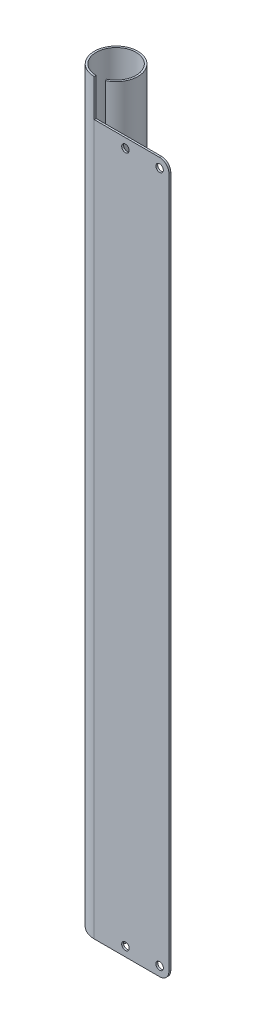
ISO-10303-21;
HEADER;
FILE_DESCRIPTION(('STEP AP214'),'2;1');
FILE_NAME('part.step','',(''),(''),'','','');
FILE_SCHEMA(('AUTOMOTIVE_DESIGN { 1 0 10303 214 1 1 1 1 }'));
ENDSEC;
DATA;
#1=APPLICATION_CONTEXT('core data for automotive mechanical design processes');
#2=APPLICATION_PROTOCOL_DEFINITION('international standard','automotive_design',2000,#1);
#3=PRODUCT_CONTEXT('',#1,'mechanical');
#4=PRODUCT('Part','Part','',(#3));
#5=PRODUCT_RELATED_PRODUCT_CATEGORY('part','',(#4));
#6=PRODUCT_DEFINITION_FORMATION('','',#4);
#7=PRODUCT_DEFINITION_CONTEXT('part definition',#1,'design');
#8=PRODUCT_DEFINITION('design','',#6,#7);
#9=PRODUCT_DEFINITION_SHAPE('','',#8);
#10=(LENGTH_UNIT() NAMED_UNIT(*) SI_UNIT(.MILLI.,.METRE.));
#11=(NAMED_UNIT(*) PLANE_ANGLE_UNIT() SI_UNIT($,.RADIAN.));
#12=(NAMED_UNIT(*) SI_UNIT($,.STERADIAN.) SOLID_ANGLE_UNIT());
#13=UNCERTAINTY_MEASURE_WITH_UNIT(LENGTH_MEASURE(1.E-05),#10,'distance_accuracy_value','');
#14=(GEOMETRIC_REPRESENTATION_CONTEXT(3) GLOBAL_UNCERTAINTY_ASSIGNED_CONTEXT((#13)) GLOBAL_UNIT_ASSIGNED_CONTEXT((#10,
#11,#12)) REPRESENTATION_CONTEXT('',''));
#15=CARTESIAN_POINT('',(0.,0.,0.));
#16=DIRECTION('',(0.,0.,1.));
#17=DIRECTION('',(1.,0.,0.));
#18=AXIS2_PLACEMENT_3D('',#15,#16,#17);
#19=CARTESIAN_POINT('',(40.,-400.,-1.));
#20=DIRECTION('',(-1.,0.,0.));
#21=DIRECTION('',(0.,0.,1.));
#22=AXIS2_PLACEMENT_3D('',#19,#20,#21);
#23=PLANE('',#22);
#24=DIRECTION('',(0.,0.,-1.));
#25=VECTOR('',#24,1.);
#26=CARTESIAN_POINT('',(40.,-395.,0.));
#27=LINE('',#26,#25);
#28=CARTESIAN_POINT('',(40.,-395.,0.));
#29=VERTEX_POINT('',#28);
#30=CARTESIAN_POINT('',(40.,-395.,-1.));
#31=VERTEX_POINT('',#30);
#32=EDGE_CURVE('E116',#29,#31,#27,.T.);
#33=ORIENTED_EDGE('',*,*,#32,.T.);
#34=DIRECTION('',(0.,1.,0.));
#35=VECTOR('',#34,1.);
#36=CARTESIAN_POINT('',(40.,-400.,-1.));
#37=LINE('',#36,#35);
#38=CARTESIAN_POINT('',(40.,-25.,-1.));
#39=VERTEX_POINT('',#38);
#40=EDGE_CURVE('E136',#31,#39,#37,.T.);
#41=ORIENTED_EDGE('',*,*,#40,.T.);
#42=DIRECTION('',(0.,0.,1.));
#43=VECTOR('',#42,1.);
#44=CARTESIAN_POINT('',(40.,-25.,-23.401));
#45=LINE('',#44,#43);
#46=CARTESIAN_POINT('',(40.,-25.,0.));
#47=VERTEX_POINT('',#46);
#48=EDGE_CURVE('E135',#39,#47,#45,.T.);
#49=ORIENTED_EDGE('',*,*,#48,.T.);
#50=DIRECTION('',(0.,1.,0.));
#51=VECTOR('',#50,1.);
#52=CARTESIAN_POINT('',(40.,-400.,0.));
#53=LINE('',#52,#51);
#54=EDGE_CURVE('E128',#29,#47,#53,.T.);
#55=ORIENTED_EDGE('',*,*,#54,.F.);
#56=EDGE_LOOP('',(#33,#41,#49,#55));
#57=FACE_BOUND('',#56,.T.);
#58=ADVANCED_FACE('F36',(#57),#23,.F.);
#59=CARTESIAN_POINT('',(0.,-400.,-1.));
#60=DIRECTION('',(0.,0.,-1.));
#61=DIRECTION('',(-1.,0.,0.));
#62=AXIS2_PLACEMENT_3D('',#59,#60,#61);
#63=PLANE('',#62);
#64=CARTESIAN_POINT('',(35.,-395.,-1.));
#65=DIRECTION('',(0.,0.,1.));
#66=DIRECTION('',(1.,0.,0.));
#67=AXIS2_PLACEMENT_3D('',#64,#65,#66);
#68=CIRCLE('',#67,5.);
#69=CARTESIAN_POINT('',(35.,-400.,-1.));
#70=VERTEX_POINT('',#69);
#71=EDGE_CURVE('E118',#70,#31,#68,.T.);
#72=ORIENTED_EDGE('',*,*,#71,.F.);
#73=DIRECTION('',(1.,0.,0.));
#74=VECTOR('',#73,1.);
#75=CARTESIAN_POINT('',(0.,-400.,-1.));
#76=LINE('',#75,#74);
#77=CARTESIAN_POINT('',(0.,-400.,-1.));
#78=VERTEX_POINT('',#77);
#79=EDGE_CURVE('E60',#70,#78,#76,.F.);
#80=ORIENTED_EDGE('',*,*,#79,.T.);
#81=DIRECTION('',(0.,1.,0.));
#82=VECTOR('',#81,1.);
#83=CARTESIAN_POINT('',(0.,-400.,-1.));
#84=LINE('',#83,#82);
#85=CARTESIAN_POINT('',(0.,-20.,-1.));
#86=VERTEX_POINT('',#85);
#87=EDGE_CURVE('E139',#78,#86,#84,.T.);
#88=ORIENTED_EDGE('',*,*,#87,.T.);
#89=DIRECTION('',(1.,0.,0.));
#90=VECTOR('',#89,1.);
#91=CARTESIAN_POINT('',(0.,-20.,-1.));
#92=LINE('',#91,#90);
#93=CARTESIAN_POINT('',(35.,-20.,-1.));
#94=VERTEX_POINT('',#93);
#95=EDGE_CURVE('E174',#86,#94,#92,.T.);
#96=ORIENTED_EDGE('',*,*,#95,.T.);
#97=CARTESIAN_POINT('',(35.,-25.,-1.));
#98=DIRECTION('',(0.,0.,-1.));
#99=DIRECTION('',(-1.,0.,0.));
#100=AXIS2_PLACEMENT_3D('',#97,#98,#99);
#101=CIRCLE('',#100,5.);
#102=EDGE_CURVE('E173',#94,#39,#101,.T.);
#103=ORIENTED_EDGE('',*,*,#102,.T.);
#104=ORIENTED_EDGE('',*,*,#40,.F.);
#105=EDGE_LOOP('',(#72,#80,#88,#96,#103,#104));
#106=FACE_BOUND('',#105,.T.);
#107=CARTESIAN_POINT('',(16.7,-25.,-1.));
#108=DIRECTION('',(0.,0.,-1.));
#109=DIRECTION('',(1.,0.,0.));
#110=AXIS2_PLACEMENT_3D('',#107,#108,#109);
#111=CIRCLE('',#110,2.);
#112=CARTESIAN_POINT('',(18.7,-25.,-1.));
#113=VERTEX_POINT('',#112);
#114=EDGE_CURVE('E194',#113,#113,#111,.T.);
#115=ORIENTED_EDGE('',*,*,#114,.F.);
#116=EDGE_LOOP('',(#115));
#117=FACE_BOUND('',#116,.T.);
#118=CARTESIAN_POINT('',(16.7,-395.,-1.));
#119=DIRECTION('',(0.,0.,-1.));
#120=DIRECTION('',(-1.,0.,0.));
#121=AXIS2_PLACEMENT_3D('',#118,#119,#120);
#122=CIRCLE('',#121,2.);
#123=CARTESIAN_POINT('',(14.7,-395.,-1.));
#124=VERTEX_POINT('',#123);
#125=EDGE_CURVE('E209',#124,#124,#122,.T.);
#126=ORIENTED_EDGE('',*,*,#125,.F.);
#127=EDGE_LOOP('',(#126));
#128=FACE_BOUND('',#127,.T.);
#129=CARTESIAN_POINT('',(35.,-395.,-1.));
#130=DIRECTION('',(0.,0.,-1.));
#131=DIRECTION('',(1.,0.,0.));
#132=AXIS2_PLACEMENT_3D('',#129,#130,#131);
#133=CIRCLE('',#132,2.);
#134=CARTESIAN_POINT('',(37.,-395.,-1.));
#135=VERTEX_POINT('',#134);
#136=EDGE_CURVE('E203',#135,#135,#133,.T.);
#137=ORIENTED_EDGE('',*,*,#136,.F.);
#138=EDGE_LOOP('',(#137));
#139=FACE_BOUND('',#138,.T.);
#140=CARTESIAN_POINT('',(35.,-25.,-1.));
#141=DIRECTION('',(0.,0.,-1.));
#142=DIRECTION('',(-1.,0.,0.));
#143=AXIS2_PLACEMENT_3D('',#140,#141,#142);
#144=CIRCLE('',#143,2.);
#145=CARTESIAN_POINT('',(33.,-25.,-1.));
#146=VERTEX_POINT('',#145);
#147=EDGE_CURVE('E189',#146,#146,#144,.T.);
#148=ORIENTED_EDGE('',*,*,#147,.F.);
#149=EDGE_LOOP('',(#148));
#150=FACE_BOUND('',#149,.T.);
#151=ADVANCED_FACE('F225',(#106,#117,#128,#139,#150),#63,.T.);
#152=CARTESIAN_POINT('',(0.,-400.,0.));
#153=DIRECTION('',(0.,0.,-1.));
#154=DIRECTION('',(-1.,0.,0.));
#155=AXIS2_PLACEMENT_3D('',#152,#153,#154);
#156=PLANE('',#155);
#157=CARTESIAN_POINT('',(16.7,-25.,0.));
#158=DIRECTION('',(0.,0.,-1.));
#159=DIRECTION('',(1.,0.,0.));
#160=AXIS2_PLACEMENT_3D('',#157,#158,#159);
#161=CIRCLE('',#160,2.);
#162=CARTESIAN_POINT('',(18.7,-25.,0.));
#163=VERTEX_POINT('',#162);
#164=EDGE_CURVE('E197',#163,#163,#161,.T.);
#165=ORIENTED_EDGE('',*,*,#164,.T.);
#166=EDGE_LOOP('',(#165));
#167=FACE_BOUND('',#166,.T.);
#168=CARTESIAN_POINT('',(16.7,-395.,0.));
#169=DIRECTION('',(0.,0.,-1.));
#170=DIRECTION('',(-1.,0.,0.));
#171=AXIS2_PLACEMENT_3D('',#168,#169,#170);
#172=CIRCLE('',#171,2.);
#173=CARTESIAN_POINT('',(14.7,-395.,0.));
#174=VERTEX_POINT('',#173);
#175=EDGE_CURVE('E198',#174,#174,#172,.T.);
#176=ORIENTED_EDGE('',*,*,#175,.T.);
#177=EDGE_LOOP('',(#176));
#178=FACE_BOUND('',#177,.T.);
#179=CARTESIAN_POINT('',(35.,-395.,0.));
#180=DIRECTION('',(0.,0.,-1.));
#181=DIRECTION('',(1.,0.,0.));
#182=AXIS2_PLACEMENT_3D('',#179,#180,#181);
#183=CIRCLE('',#182,2.);
#184=CARTESIAN_POINT('',(37.,-395.,0.));
#185=VERTEX_POINT('',#184);
#186=EDGE_CURVE('E206',#185,#185,#183,.T.);
#187=ORIENTED_EDGE('',*,*,#186,.T.);
#188=EDGE_LOOP('',(#187));
#189=FACE_BOUND('',#188,.T.);
#190=CARTESIAN_POINT('',(35.,-25.,0.));
#191=DIRECTION('',(0.,0.,-1.));
#192=DIRECTION('',(-1.,0.,0.));
#193=AXIS2_PLACEMENT_3D('',#190,#191,#192);
#194=CIRCLE('',#193,2.);
#195=CARTESIAN_POINT('',(33.,-25.,0.));
#196=VERTEX_POINT('',#195);
#197=EDGE_CURVE('E177',#196,#196,#194,.T.);
#198=ORIENTED_EDGE('',*,*,#197,.T.);
#199=EDGE_LOOP('',(#198));
#200=FACE_BOUND('',#199,.T.);
#201=DIRECTION('',(-1.,0.,0.));
#202=VECTOR('',#201,1.);
#203=CARTESIAN_POINT('',(0.,-400.,0.));
#204=LINE('',#203,#202);
#205=CARTESIAN_POINT('',(35.,-400.,0.));
#206=VERTEX_POINT('',#205);
#207=CARTESIAN_POINT('',(0.,-400.,0.));
#208=VERTEX_POINT('',#207);
#209=EDGE_CURVE('E131',#206,#208,#204,.T.);
#210=ORIENTED_EDGE('',*,*,#209,.F.);
#211=CARTESIAN_POINT('',(35.,-395.,0.));
#212=DIRECTION('',(0.,0.,1.));
#213=DIRECTION('',(1.,0.,0.));
#214=AXIS2_PLACEMENT_3D('',#211,#212,#213);
#215=CIRCLE('',#214,5.);
#216=EDGE_CURVE('E51',#206,#29,#215,.T.);
#217=ORIENTED_EDGE('',*,*,#216,.T.);
#218=ORIENTED_EDGE('',*,*,#54,.T.);
#219=CARTESIAN_POINT('',(35.,-25.,0.));
#220=DIRECTION('',(0.,0.,-1.));
#221=DIRECTION('',(-1.,0.,0.));
#222=AXIS2_PLACEMENT_3D('',#219,#220,#221);
#223=CIRCLE('',#222,5.);
#224=CARTESIAN_POINT('',(35.,-20.,0.));
#225=VERTEX_POINT('',#224);
#226=EDGE_CURVE('E163',#225,#47,#223,.T.);
#227=ORIENTED_EDGE('',*,*,#226,.F.);
#228=DIRECTION('',(1.,0.,0.));
#229=VECTOR('',#228,1.);
#230=CARTESIAN_POINT('',(0.,-20.,0.));
#231=LINE('',#230,#229);
#232=CARTESIAN_POINT('',(0.,-20.,0.));
#233=VERTEX_POINT('',#232);
#234=EDGE_CURVE('E182',#233,#225,#231,.T.);
#235=ORIENTED_EDGE('',*,*,#234,.F.);
#236=DIRECTION('',(0.,1.,0.));
#237=VECTOR('',#236,1.);
#238=CARTESIAN_POINT('',(0.,-400.,0.));
#239=LINE('',#238,#237);
#240=EDGE_CURVE('E137',#208,#233,#239,.T.);
#241=ORIENTED_EDGE('',*,*,#240,.F.);
#242=EDGE_LOOP('',(#210,#217,#218,#227,#235,#241));
#243=FACE_BOUND('',#242,.T.);
#244=ADVANCED_FACE('F126',(#167,#178,#189,#200,#243),#156,.F.);
#245=CARTESIAN_POINT('',(0.,-400.,0.));
#246=DIRECTION('',(0.,-1.,0.));
#247=DIRECTION('',(0.,0.,-1.));
#248=AXIS2_PLACEMENT_3D('',#245,#246,#247);
#249=PLANE('',#248);
#250=DIRECTION('',(0.,0.,-1.));
#251=VECTOR('',#250,1.);
#252=CARTESIAN_POINT('',(0.,-400.,0.));
#253=LINE('',#252,#251);
#254=EDGE_CURVE('E11',#208,#78,#253,.T.);
#255=ORIENTED_EDGE('',*,*,#254,.F.);
#256=CARTESIAN_POINT('',(0.,-400.,-11.7));
#257=DIRECTION('',(0.,-1.,0.));
#258=DIRECTION('',(0.,0.,-1.));
#259=AXIS2_PLACEMENT_3D('',#256,#257,#258);
#260=CIRCLE('',#259,11.7);
#261=CARTESIAN_POINT('',(4.95277699881593,-400.,-1.10000000000001));
#262=VERTEX_POINT('',#261);
#263=EDGE_CURVE('E166',#208,#262,#260,.T.);
#264=ORIENTED_EDGE('',*,*,#263,.T.);
#265=DIRECTION('',(-0.423314273403074,0.,-0.905982905982904));
#266=VECTOR('',#265,1.);
#267=CARTESIAN_POINT('',(4.95277699881593,-400.,-1.10000000000001));
#268=LINE('',#267,#266);
#269=CARTESIAN_POINT('',(4.52946272541285,-400.,-2.00598290598291));
#270=VERTEX_POINT('',#269);
#271=EDGE_CURVE('E87',#262,#270,#268,.T.);
#272=ORIENTED_EDGE('',*,*,#271,.T.);
#273=CARTESIAN_POINT('',(0.,-400.,-11.7));
#274=DIRECTION('',(0.,1.,0.));
#275=DIRECTION('',(1.,0.,0.));
#276=AXIS2_PLACEMENT_3D('',#273,#274,#275);
#277=CIRCLE('',#276,10.7);
#278=EDGE_CURVE('E156',#78,#270,#277,.F.);
#279=ORIENTED_EDGE('',*,*,#278,.F.);
#280=EDGE_LOOP('',(#255,#264,#272,#279));
#281=FACE_BOUND('',#280,.T.);
#282=ADVANCED_FACE('F38',(#281),#249,.T.);
#283=CARTESIAN_POINT('',(0.,0.,-1.));
#284=DIRECTION('',(0.,1.,0.));
#285=DIRECTION('',(0.,0.,1.));
#286=AXIS2_PLACEMENT_3D('',#283,#284,#285);
#287=PLANE('',#286);
#288=DIRECTION('',(0.,0.,1.));
#289=VECTOR('',#288,1.);
#290=CARTESIAN_POINT('',(0.,0.,-1.));
#291=LINE('',#290,#289);
#292=CARTESIAN_POINT('',(0.,0.,-1.));
#293=VERTEX_POINT('',#292);
#294=CARTESIAN_POINT('',(0.,0.,0.));
#295=VERTEX_POINT('',#294);
#296=EDGE_CURVE('E44',#293,#295,#291,.T.);
#297=ORIENTED_EDGE('',*,*,#296,.F.);
#298=CARTESIAN_POINT('',(0.,0.,-11.7));
#299=DIRECTION('',(0.,1.,0.));
#300=DIRECTION('',(1.,0.,0.));
#301=AXIS2_PLACEMENT_3D('',#298,#299,#300);
#302=CIRCLE('',#301,10.7);
#303=CARTESIAN_POINT('',(4.52946272541285,0.,-2.00598290598291));
#304=VERTEX_POINT('',#303);
#305=EDGE_CURVE('E160',#293,#304,#302,.F.);
#306=ORIENTED_EDGE('',*,*,#305,.T.);
#307=DIRECTION('',(-0.423314273403074,0.,-0.905982905982904));
#308=VECTOR('',#307,1.);
#309=CARTESIAN_POINT('',(4.95277699881593,0.,-1.10000000000001));
#310=LINE('',#309,#308);
#311=CARTESIAN_POINT('',(4.95277699881593,0.,-1.10000000000001));
#312=VERTEX_POINT('',#311);
#313=EDGE_CURVE('E157',#312,#304,#310,.T.);
#314=ORIENTED_EDGE('',*,*,#313,.F.);
#315=CARTESIAN_POINT('',(0.,0.,-11.7));
#316=DIRECTION('',(0.,-1.,0.));
#317=DIRECTION('',(0.,0.,-1.));
#318=AXIS2_PLACEMENT_3D('',#315,#316,#317);
#319=CIRCLE('',#318,11.7);
#320=EDGE_CURVE('E154',#295,#312,#319,.T.);
#321=ORIENTED_EDGE('',*,*,#320,.F.);
#322=EDGE_LOOP('',(#297,#306,#314,#321));
#323=FACE_BOUND('',#322,.T.);
#324=ADVANCED_FACE('F268',(#323),#287,.T.);
#325=CARTESIAN_POINT('',(0.,-400.,-11.7));
#326=DIRECTION('',(0.,1.,0.));
#327=DIRECTION('',(0.,0.,1.));
#328=AXIS2_PLACEMENT_3D('',#325,#326,#327);
#329=CYLINDRICAL_SURFACE('',#328,10.7);
#330=ORIENTED_EDGE('',*,*,#305,.F.);
#331=DIRECTION('',(0.,-1.,0.));
#332=VECTOR('',#331,1.);
#333=CARTESIAN_POINT('',(0.,0.,-1.));
#334=LINE('',#333,#332);
#335=EDGE_CURVE('E79',#293,#86,#334,.T.);
#336=ORIENTED_EDGE('',*,*,#335,.T.);
#337=ORIENTED_EDGE('',*,*,#87,.F.);
#338=ORIENTED_EDGE('',*,*,#278,.T.);
#339=DIRECTION('',(0.,1.,0.));
#340=VECTOR('',#339,1.);
#341=CARTESIAN_POINT('',(4.52946272541285,-400.,-2.00598290598291));
#342=LINE('',#341,#340);
#343=EDGE_CURVE('E148',#270,#304,#342,.T.);
#344=ORIENTED_EDGE('',*,*,#343,.T.);
#345=EDGE_LOOP('',(#330,#336,#337,#338,#344));
#346=FACE_BOUND('',#345,.T.);
#347=ADVANCED_FACE('F261',(#346),#329,.F.);
#348=CARTESIAN_POINT('',(0.,-400.,-11.7));
#349=DIRECTION('',(0.,1.,0.));
#350=DIRECTION('',(0.,0.,1.));
#351=AXIS2_PLACEMENT_3D('',#348,#349,#350);
#352=CYLINDRICAL_SURFACE('',#351,11.7);
#353=ORIENTED_EDGE('',*,*,#320,.T.);
#354=DIRECTION('',(0.,1.,0.));
#355=VECTOR('',#354,1.);
#356=CARTESIAN_POINT('',(4.95277699881593,-400.,-1.10000000000001));
#357=LINE('',#356,#355);
#358=EDGE_CURVE('E142',#262,#312,#357,.T.);
#359=ORIENTED_EDGE('',*,*,#358,.F.);
#360=ORIENTED_EDGE('',*,*,#263,.F.);
#361=ORIENTED_EDGE('',*,*,#240,.T.);
#362=DIRECTION('',(0.,-1.,0.));
#363=VECTOR('',#362,1.);
#364=CARTESIAN_POINT('',(0.,0.,0.));
#365=LINE('',#364,#363);
#366=EDGE_CURVE('E180',#295,#233,#365,.T.);
#367=ORIENTED_EDGE('',*,*,#366,.F.);
#368=EDGE_LOOP('',(#353,#359,#360,#361,#367));
#369=FACE_BOUND('',#368,.T.);
#370=ADVANCED_FACE('F257',(#369),#352,.T.);
#371=CARTESIAN_POINT('',(4.95277699881593,-400.,-1.10000000000001));
#372=DIRECTION('',(0.905982905982904,0.,-0.423314273403074));
#373=DIRECTION('',(-0.423314273403074,0.,-0.905982905982904));
#374=AXIS2_PLACEMENT_3D('',#371,#372,#373);
#375=PLANE('',#374);
#376=ORIENTED_EDGE('',*,*,#313,.T.);
#377=ORIENTED_EDGE('',*,*,#343,.F.);
#378=ORIENTED_EDGE('',*,*,#271,.F.);
#379=ORIENTED_EDGE('',*,*,#358,.T.);
#380=EDGE_LOOP('',(#376,#377,#378,#379));
#381=FACE_BOUND('',#380,.T.);
#382=ADVANCED_FACE('F260',(#381),#375,.F.);
#383=CARTESIAN_POINT('',(0.,-400.,-11.7));
#384=DIRECTION('',(0.,1.,0.));
#385=DIRECTION('',(1.,0.,0.));
#386=AXIS2_PLACEMENT_3D('',#383,#384,#385);
#387=PLANE('',#386);
#388=ORIENTED_EDGE('',*,*,#79,.F.);
#389=DIRECTION('',(0.,0.,-1.));
#390=VECTOR('',#389,1.);
#391=CARTESIAN_POINT('',(35.,-400.,0.));
#392=LINE('',#391,#390);
#393=EDGE_CURVE('E122',#206,#70,#392,.T.);
#394=ORIENTED_EDGE('',*,*,#393,.F.);
#395=ORIENTED_EDGE('',*,*,#209,.T.);
#396=ORIENTED_EDGE('',*,*,#254,.T.);
#397=EDGE_LOOP('',(#388,#394,#395,#396));
#398=FACE_BOUND('',#397,.T.);
#399=ADVANCED_FACE('F265',(#398),#387,.F.);
#400=CARTESIAN_POINT('',(0.,-20.,-23.401));
#401=DIRECTION('',(0.,-1.,0.));
#402=DIRECTION('',(1.,0.,0.));
#403=AXIS2_PLACEMENT_3D('',#400,#401,#402);
#404=PLANE('',#403);
#405=DIRECTION('',(0.,0.,1.));
#406=VECTOR('',#405,1.);
#407=CARTESIAN_POINT('',(0.,-20.,-23.401));
#408=LINE('',#407,#406);
#409=EDGE_CURVE('E171',#86,#233,#408,.T.);
#410=ORIENTED_EDGE('',*,*,#409,.T.);
#411=ORIENTED_EDGE('',*,*,#234,.T.);
#412=DIRECTION('',(0.,0.,1.));
#413=VECTOR('',#412,1.);
#414=CARTESIAN_POINT('',(35.,-20.,-23.401));
#415=LINE('',#414,#413);
#416=EDGE_CURVE('E176',#94,#225,#415,.T.);
#417=ORIENTED_EDGE('',*,*,#416,.F.);
#418=ORIENTED_EDGE('',*,*,#95,.F.);
#419=EDGE_LOOP('',(#410,#411,#417,#418));
#420=FACE_BOUND('',#419,.T.);
#421=ADVANCED_FACE('F284',(#420),#404,.F.);
#422=CARTESIAN_POINT('',(0.,0.,-23.401));
#423=DIRECTION('',(-1.,0.,0.));
#424=DIRECTION('',(0.,-1.,0.));
#425=AXIS2_PLACEMENT_3D('',#422,#423,#424);
#426=PLANE('',#425);
#427=ORIENTED_EDGE('',*,*,#296,.T.);
#428=ORIENTED_EDGE('',*,*,#366,.T.);
#429=ORIENTED_EDGE('',*,*,#409,.F.);
#430=ORIENTED_EDGE('',*,*,#335,.F.);
#431=EDGE_LOOP('',(#427,#428,#429,#430));
#432=FACE_BOUND('',#431,.T.);
#433=ADVANCED_FACE('F281',(#432),#426,.F.);
#434=CARTESIAN_POINT('',(35.,-25.,-23.401));
#435=DIRECTION('',(0.,0.,1.));
#436=DIRECTION('',(1.,0.,0.));
#437=AXIS2_PLACEMENT_3D('',#434,#435,#436);
#438=CYLINDRICAL_SURFACE('',#437,5.);
#439=ORIENTED_EDGE('',*,*,#416,.T.);
#440=ORIENTED_EDGE('',*,*,#226,.T.);
#441=ORIENTED_EDGE('',*,*,#48,.F.);
#442=ORIENTED_EDGE('',*,*,#102,.F.);
#443=EDGE_LOOP('',(#439,#440,#441,#442));
#444=FACE_BOUND('',#443,.T.);
#445=ADVANCED_FACE('F243',(#444),#438,.T.);
#446=CARTESIAN_POINT('',(35.,-395.,0.));
#447=DIRECTION('',(0.,0.,-1.));
#448=DIRECTION('',(-1.,0.,0.));
#449=AXIS2_PLACEMENT_3D('',#446,#447,#448);
#450=CYLINDRICAL_SURFACE('',#449,5.);
#451=ORIENTED_EDGE('',*,*,#71,.T.);
#452=ORIENTED_EDGE('',*,*,#32,.F.);
#453=ORIENTED_EDGE('',*,*,#216,.F.);
#454=ORIENTED_EDGE('',*,*,#393,.T.);
#455=EDGE_LOOP('',(#451,#452,#453,#454));
#456=FACE_BOUND('',#455,.T.);
#457=ADVANCED_FACE('F117',(#456),#450,.T.);
#458=CARTESIAN_POINT('',(35.,-25.,0.));
#459=DIRECTION('',(0.,0.,-1.));
#460=DIRECTION('',(-1.,0.,0.));
#461=AXIS2_PLACEMENT_3D('',#458,#459,#460);
#462=CYLINDRICAL_SURFACE('',#461,2.);
#463=ORIENTED_EDGE('',*,*,#197,.F.);
#464=EDGE_LOOP('',(#463));
#465=FACE_BOUND('',#464,.T.);
#466=ORIENTED_EDGE('',*,*,#147,.T.);
#467=EDGE_LOOP('',(#466));
#468=FACE_BOUND('',#467,.T.);
#469=ADVANCED_FACE('F233',(#465,#468),#462,.F.);
#470=CARTESIAN_POINT('',(35.,-395.,0.));
#471=DIRECTION('',(0.,0.,-1.));
#472=DIRECTION('',(-1.,0.,0.));
#473=AXIS2_PLACEMENT_3D('',#470,#471,#472);
#474=CYLINDRICAL_SURFACE('',#473,2.);
#475=ORIENTED_EDGE('',*,*,#186,.F.);
#476=EDGE_LOOP('',(#475));
#477=FACE_BOUND('',#476,.T.);
#478=ORIENTED_EDGE('',*,*,#136,.T.);
#479=EDGE_LOOP('',(#478));
#480=FACE_BOUND('',#479,.T.);
#481=ADVANCED_FACE('F221',(#477,#480),#474,.F.);
#482=CARTESIAN_POINT('',(16.7,-395.,0.));
#483=DIRECTION('',(0.,0.,-1.));
#484=DIRECTION('',(-1.,0.,0.));
#485=AXIS2_PLACEMENT_3D('',#482,#483,#484);
#486=CYLINDRICAL_SURFACE('',#485,2.);
#487=ORIENTED_EDGE('',*,*,#175,.F.);
#488=EDGE_LOOP('',(#487));
#489=FACE_BOUND('',#488,.T.);
#490=ORIENTED_EDGE('',*,*,#125,.T.);
#491=EDGE_LOOP('',(#490));
#492=FACE_BOUND('',#491,.T.);
#493=ADVANCED_FACE('F217',(#489,#492),#486,.F.);
#494=CARTESIAN_POINT('',(16.7,-25.,0.));
#495=DIRECTION('',(0.,0.,-1.));
#496=DIRECTION('',(-1.,0.,0.));
#497=AXIS2_PLACEMENT_3D('',#494,#495,#496);
#498=CYLINDRICAL_SURFACE('',#497,2.);
#499=ORIENTED_EDGE('',*,*,#164,.F.);
#500=EDGE_LOOP('',(#499));
#501=FACE_BOUND('',#500,.T.);
#502=ORIENTED_EDGE('',*,*,#114,.T.);
#503=EDGE_LOOP('',(#502));
#504=FACE_BOUND('',#503,.T.);
#505=ADVANCED_FACE('F220',(#501,#504),#498,.F.);
#506=CLOSED_SHELL('',(#58,#151,#244,#282,#324,#347,#370,#382,#399,#421,#433,#445,#457,#469,#481,
#493,#505));
#507=MANIFOLD_SOLID_BREP('B2',#506);
#508=ADVANCED_BREP_SHAPE_REPRESENTATION('',(#18,#507),#14);
#509=SHAPE_DEFINITION_REPRESENTATION(#9,#508);
ENDSEC;
END-ISO-10303-21;
